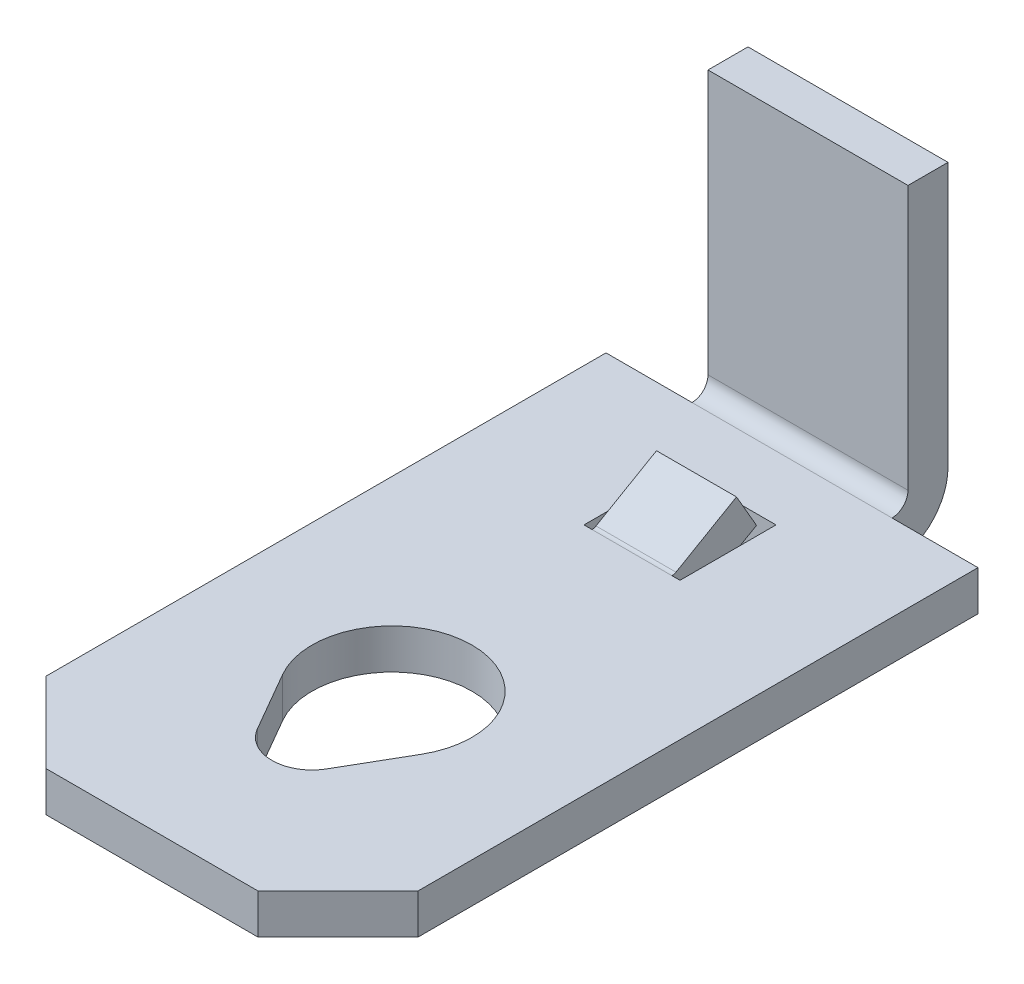
ISO-10303-21;
HEADER;
FILE_DESCRIPTION(('STEP AP214'),'2;1');
FILE_NAME('part.step','',(''),(''),'','','');
FILE_SCHEMA(('AUTOMOTIVE_DESIGN { 1 0 10303 214 1 1 1 1 }'));
ENDSEC;
DATA;
#1=APPLICATION_CONTEXT('core data for automotive mechanical design processes');
#2=APPLICATION_PROTOCOL_DEFINITION('international standard','automotive_design',2000,#1);
#3=PRODUCT_CONTEXT('',#1,'mechanical');
#4=PRODUCT('Part','Part','',(#3));
#5=PRODUCT_RELATED_PRODUCT_CATEGORY('part','',(#4));
#6=PRODUCT_DEFINITION_FORMATION('','',#4);
#7=PRODUCT_DEFINITION_CONTEXT('part definition',#1,'design');
#8=PRODUCT_DEFINITION('design','',#6,#7);
#9=PRODUCT_DEFINITION_SHAPE('','',#8);
#10=(LENGTH_UNIT() NAMED_UNIT(*) SI_UNIT(.MILLI.,.METRE.));
#11=(NAMED_UNIT(*) PLANE_ANGLE_UNIT() SI_UNIT($,.RADIAN.));
#12=(NAMED_UNIT(*) SI_UNIT($,.STERADIAN.) SOLID_ANGLE_UNIT());
#13=UNCERTAINTY_MEASURE_WITH_UNIT(LENGTH_MEASURE(1.E-05),#10,'distance_accuracy_value','');
#14=(GEOMETRIC_REPRESENTATION_CONTEXT(3) GLOBAL_UNCERTAINTY_ASSIGNED_CONTEXT((#13)) GLOBAL_UNIT_ASSIGNED_CONTEXT((#10,
#11,#12)) REPRESENTATION_CONTEXT('',''));
#15=CARTESIAN_POINT('',(0.,0.,0.));
#16=DIRECTION('',(0.,0.,1.));
#17=DIRECTION('',(1.,0.,0.));
#18=AXIS2_PLACEMENT_3D('',#15,#16,#17);
#19=CARTESIAN_POINT('',(0.,-1.29903810567665,-0.776794919243098));
#20=DIRECTION('',(0.,0.866025403784442,0.499999999999995));
#21=DIRECTION('',(0.,-0.499999999999995,0.866025403784442));
#22=AXIS2_PLACEMENT_3D('',#19,#20,#21);
#23=PLANE('',#22);
#24=DIRECTION('',(0.,0.499999999999995,-0.866025403784442));
#25=VECTOR('',#24,1.);
#26=CARTESIAN_POINT('',(-0.5,-0.419615242270665,-2.29999999999999));
#27=LINE('',#26,#25);
#28=CARTESIAN_POINT('',(-0.5,-0.419615242270665,-2.29999999999999));
#29=VERTEX_POINT('',#28);
#30=CARTESIAN_POINT('',(-0.5,0.0169872981077745,-3.0562177826491));
#31=VERTEX_POINT('',#30);
#32=EDGE_CURVE('E216',#29,#31,#27,.T.);
#33=ORIENTED_EDGE('',*,*,#32,.T.);
#34=DIRECTION('',(1.,0.,0.));
#35=VECTOR('',#34,1.);
#36=CARTESIAN_POINT('',(0.5,0.0169872981077746,-3.0562177826491));
#37=LINE('',#36,#35);
#38=CARTESIAN_POINT('',(0.5,0.0169872981077745,-3.0562177826491));
#39=VERTEX_POINT('',#38);
#40=EDGE_CURVE('E291',#31,#39,#37,.T.);
#41=ORIENTED_EDGE('',*,*,#40,.T.);
#42=DIRECTION('',(0.,-0.499999999999995,0.866025403784442));
#43=VECTOR('',#42,1.);
#44=CARTESIAN_POINT('',(0.5,0.0169872981077745,-3.0562177826491));
#45=LINE('',#44,#43);
#46=CARTESIAN_POINT('',(0.5,-0.419615242270665,-2.29999999999999));
#47=VERTEX_POINT('',#46);
#48=EDGE_CURVE('E283',#39,#47,#45,.T.);
#49=ORIENTED_EDGE('',*,*,#48,.T.);
#50=DIRECTION('',(-1.,0.,0.));
#51=VECTOR('',#50,1.);
#52=CARTESIAN_POINT('',(-0.5,-0.419615242270664,-2.29999999999999));
#53=LINE('',#52,#51);
#54=EDGE_CURVE('E263',#29,#47,#53,.F.);
#55=ORIENTED_EDGE('',*,*,#54,.F.);
#56=EDGE_LOOP('',(#33,#41,#49,#55));
#57=FACE_BOUND('',#56,.T.);
#58=ADVANCED_FACE('F17',(#57),#23,.F.);
#59=CARTESIAN_POINT('',(0.,0.,-4.7));
#60=DIRECTION('',(0.,0.,1.));
#61=DIRECTION('',(0.,-1.,0.));
#62=AXIS2_PLACEMENT_3D('',#59,#60,#61);
#63=PLANE('',#62);
#64=DIRECTION('',(0.,1.,0.));
#65=VECTOR('',#64,1.);
#66=CARTESIAN_POINT('',(-1.25,3.5,-4.7));
#67=LINE('',#66,#65);
#68=CARTESIAN_POINT('',(-1.25,0.2,-4.7));
#69=VERTEX_POINT('',#68);
#70=CARTESIAN_POINT('',(-1.25,3.5,-4.70000000000001));
#71=VERTEX_POINT('',#70);
#72=EDGE_CURVE('E285',#69,#71,#67,.T.);
#73=ORIENTED_EDGE('',*,*,#72,.T.);
#74=DIRECTION('',(1.,0.,0.));
#75=VECTOR('',#74,1.);
#76=CARTESIAN_POINT('',(1.25,3.5,-4.70000000000002));
#77=LINE('',#76,#75);
#78=CARTESIAN_POINT('',(1.25,3.5,-4.70000000000002));
#79=VERTEX_POINT('',#78);
#80=EDGE_CURVE('E273',#71,#79,#77,.T.);
#81=ORIENTED_EDGE('',*,*,#80,.T.);
#82=DIRECTION('',(0.,1.,0.));
#83=VECTOR('',#82,1.);
#84=CARTESIAN_POINT('',(1.25,0.,-4.70000000000002));
#85=LINE('',#84,#83);
#86=CARTESIAN_POINT('',(1.25,0.199999999999999,-4.70000000000001));
#87=VERTEX_POINT('',#86);
#88=EDGE_CURVE('E279',#79,#87,#85,.F.);
#89=ORIENTED_EDGE('',*,*,#88,.T.);
#90=DIRECTION('',(-1.,0.,0.));
#91=VECTOR('',#90,1.);
#92=CARTESIAN_POINT('',(-1.25,0.200000000000003,-4.7));
#93=LINE('',#92,#91);
#94=EDGE_CURVE('E218',#69,#87,#93,.F.);
#95=ORIENTED_EDGE('',*,*,#94,.F.);
#96=EDGE_LOOP('',(#73,#81,#89,#95));
#97=FACE_BOUND('',#96,.T.);
#98=ADVANCED_FACE('F777',(#97),#63,.F.);
#99=CARTESIAN_POINT('',(0.5,0.0169872981077745,-3.0562177826491));
#100=DIRECTION('',(0.,-0.499999999999995,0.866025403784442));
#101=DIRECTION('',(0.,-0.866025403784442,-0.499999999999995));
#102=AXIS2_PLACEMENT_3D('',#99,#100,#101);
#103=PLANE('',#102);
#104=DIRECTION('',(0.,-0.866025403784441,-0.499999999999995));
#105=VECTOR('',#104,1.);
#106=CARTESIAN_POINT('',(0.5,0.449999999999995,-2.80621778264911));
#107=LINE('',#106,#105);
#108=CARTESIAN_POINT('',(0.5,0.449999999999995,-2.80621778264911));
#109=VERTEX_POINT('',#108);
#110=EDGE_CURVE('E286',#109,#39,#107,.T.);
#111=ORIENTED_EDGE('',*,*,#110,.T.);
#112=ORIENTED_EDGE('',*,*,#40,.F.);
#113=DIRECTION('',(0.,-0.866025403784442,-0.499999999999995));
#114=VECTOR('',#113,1.);
#115=CARTESIAN_POINT('',(-0.5,0.0169872981077743,-3.0562177826491));
#116=LINE('',#115,#114);
#117=CARTESIAN_POINT('',(-0.5,0.449999999999995,-2.80621778264911));
#118=VERTEX_POINT('',#117);
#119=EDGE_CURVE('E300',#118,#31,#116,.T.);
#120=ORIENTED_EDGE('',*,*,#119,.F.);
#121=DIRECTION('',(1.,0.,0.));
#122=VECTOR('',#121,1.);
#123=CARTESIAN_POINT('',(0.,0.449999999999995,-2.80621778264911));
#124=LINE('',#123,#122);
#125=EDGE_CURVE('E294',#109,#118,#124,.F.);
#126=ORIENTED_EDGE('',*,*,#125,.F.);
#127=EDGE_LOOP('',(#111,#112,#120,#126));
#128=FACE_BOUND('',#127,.T.);
#129=ADVANCED_FACE('F768',(#128),#103,.F.);
#130=CARTESIAN_POINT('',(1.25,3.5,-4.70000000000002));
#131=DIRECTION('',(0.,-1.,0.));
#132=DIRECTION('',(0.,0.,-1.));
#133=AXIS2_PLACEMENT_3D('',#130,#131,#132);
#134=PLANE('',#133);
#135=DIRECTION('',(0.,0.,-1.));
#136=VECTOR('',#135,1.);
#137=CARTESIAN_POINT('',(1.25,3.5,-4.70000000000002));
#138=LINE('',#137,#136);
#139=CARTESIAN_POINT('',(1.25,3.5,-4.20000000000002));
#140=VERTEX_POINT('',#139);
#141=EDGE_CURVE('E271',#79,#140,#138,.F.);
#142=ORIENTED_EDGE('',*,*,#141,.F.);
#143=ORIENTED_EDGE('',*,*,#80,.F.);
#144=DIRECTION('',(0.,0.,-1.));
#145=VECTOR('',#144,1.);
#146=CARTESIAN_POINT('',(-1.25,3.5,-4.70000000000002));
#147=LINE('',#146,#145);
#148=CARTESIAN_POINT('',(-1.25,3.5,-4.20000000000002));
#149=VERTEX_POINT('',#148);
#150=EDGE_CURVE('E276',#149,#71,#147,.T.);
#151=ORIENTED_EDGE('',*,*,#150,.F.);
#152=DIRECTION('',(1.,0.,0.));
#153=VECTOR('',#152,1.);
#154=CARTESIAN_POINT('',(0.,3.5,-4.20000000000002));
#155=LINE('',#154,#153);
#156=EDGE_CURVE('E264',#140,#149,#155,.F.);
#157=ORIENTED_EDGE('',*,*,#156,.F.);
#158=EDGE_LOOP('',(#142,#143,#151,#157));
#159=FACE_BOUND('',#158,.T.);
#160=ADVANCED_FACE('F760',(#159),#134,.F.);
#161=CARTESIAN_POINT('',(-0.5,0.100000000000001,-2.));
#162=DIRECTION('',(-1.,0.,0.));
#163=DIRECTION('',(0.,-1.,0.));
#164=AXIS2_PLACEMENT_3D('',#161,#162,#163);
#165=CYLINDRICAL_SURFACE('',#164,0.6);
#166=ORIENTED_EDGE('',*,*,#54,.T.);
#167=CARTESIAN_POINT('',(0.5,0.1,-2.));
#168=DIRECTION('',(-1.,0.,0.));
#169=DIRECTION('',(0.,-1.,0.));
#170=AXIS2_PLACEMENT_3D('',#167,#168,#169);
#171=CIRCLE('',#170,0.6);
#172=CARTESIAN_POINT('',(0.5,-0.5,-2.));
#173=VERTEX_POINT('',#172);
#174=EDGE_CURVE('E195',#173,#47,#171,.F.);
#175=ORIENTED_EDGE('',*,*,#174,.F.);
#176=DIRECTION('',(1.,0.,0.));
#177=VECTOR('',#176,1.);
#178=CARTESIAN_POINT('',(0.,-0.5,-2.));
#179=LINE('',#178,#177);
#180=CARTESIAN_POINT('',(-0.5,-0.5,-2.));
#181=VERTEX_POINT('',#180);
#182=EDGE_CURVE('E188',#173,#181,#179,.F.);
#183=ORIENTED_EDGE('',*,*,#182,.T.);
#184=CARTESIAN_POINT('',(-0.5,0.100000000000001,-2.));
#185=DIRECTION('',(-1.,0.,0.));
#186=DIRECTION('',(0.,-1.,0.));
#187=AXIS2_PLACEMENT_3D('',#184,#185,#186);
#188=CIRCLE('',#187,0.6);
#189=EDGE_CURVE('E20',#181,#29,#188,.F.);
#190=ORIENTED_EDGE('',*,*,#189,.T.);
#191=EDGE_LOOP('',(#166,#175,#183,#190));
#192=FACE_BOUND('',#191,.T.);
#193=ADVANCED_FACE('F191',(#192),#165,.T.);
#194=CARTESIAN_POINT('',(-1.25,0.199999999999998,-4.));
#195=DIRECTION('',(-1.,0.,0.));
#196=DIRECTION('',(0.,0.,1.));
#197=AXIS2_PLACEMENT_3D('',#194,#195,#196);
#198=CYLINDRICAL_SURFACE('',#197,0.700000000000001);
#199=ORIENTED_EDGE('',*,*,#94,.T.);
#200=CARTESIAN_POINT('',(1.25,0.199999999999998,-4.));
#201=DIRECTION('',(-1.,0.,0.));
#202=DIRECTION('',(0.,0.,1.));
#203=AXIS2_PLACEMENT_3D('',#200,#201,#202);
#204=CIRCLE('',#203,0.700000000000001);
#205=CARTESIAN_POINT('',(1.25,-0.500000000000002,-4.));
#206=VERTEX_POINT('',#205);
#207=EDGE_CURVE('E267',#206,#87,#204,.F.);
#208=ORIENTED_EDGE('',*,*,#207,.F.);
#209=DIRECTION('',(1.,0.,0.));
#210=VECTOR('',#209,1.);
#211=CARTESIAN_POINT('',(0.,-0.5,-4.));
#212=LINE('',#211,#210);
#213=CARTESIAN_POINT('',(-1.25,-0.500000000000002,-4.));
#214=VERTEX_POINT('',#213);
#215=EDGE_CURVE('E198',#206,#214,#212,.F.);
#216=ORIENTED_EDGE('',*,*,#215,.T.);
#217=CARTESIAN_POINT('',(-1.25,0.199999999999998,-4.));
#218=DIRECTION('',(-1.,0.,0.));
#219=DIRECTION('',(0.,0.,1.));
#220=AXIS2_PLACEMENT_3D('',#217,#218,#219);
#221=CIRCLE('',#220,0.700000000000001);
#222=EDGE_CURVE('E199',#214,#69,#221,.F.);
#223=ORIENTED_EDGE('',*,*,#222,.T.);
#224=EDGE_LOOP('',(#199,#208,#216,#223));
#225=FACE_BOUND('',#224,.T.);
#226=ADVANCED_FACE('F744',(#225),#198,.T.);
#227=CARTESIAN_POINT('',(-0.5,0.100000000000001,-2.));
#228=DIRECTION('',(1.,0.,0.));
#229=DIRECTION('',(0.,1.,0.));
#230=AXIS2_PLACEMENT_3D('',#227,#228,#229);
#231=PLANE('',#230);
#232=CARTESIAN_POINT('',(-0.5,0.100000000000001,-2.));
#233=DIRECTION('',(-1.,0.,0.));
#234=DIRECTION('',(0.,-1.,0.));
#235=AXIS2_PLACEMENT_3D('',#232,#233,#234);
#236=CIRCLE('',#235,0.1);
#237=CARTESIAN_POINT('',(-0.5,0.,-2.));
#238=VERTEX_POINT('',#237);
#239=CARTESIAN_POINT('',(-0.5,0.0133974596215563,-2.05));
#240=VERTEX_POINT('',#239);
#241=EDGE_CURVE('E344',#238,#240,#236,.F.);
#242=ORIENTED_EDGE('',*,*,#241,.T.);
#243=DIRECTION('',(0.,-0.499999999999995,0.866025403784442));
#244=VECTOR('',#243,1.);
#245=CARTESIAN_POINT('',(-0.5,-0.866025403784431,-0.526794919243101));
#246=LINE('',#245,#244);
#247=EDGE_CURVE('E217',#118,#240,#246,.T.);
#248=ORIENTED_EDGE('',*,*,#247,.F.);
#249=ORIENTED_EDGE('',*,*,#119,.T.);
#250=ORIENTED_EDGE('',*,*,#32,.F.);
#251=ORIENTED_EDGE('',*,*,#189,.F.);
#252=DIRECTION('',(0.,1.,0.));
#253=VECTOR('',#252,1.);
#254=CARTESIAN_POINT('',(-0.5,-0.500050000000003,-2.));
#255=LINE('',#254,#253);
#256=EDGE_CURVE('E209',#181,#238,#255,.T.);
#257=ORIENTED_EDGE('',*,*,#256,.T.);
#258=EDGE_LOOP('',(#242,#248,#249,#250,#251,#257));
#259=FACE_BOUND('',#258,.T.);
#260=ADVANCED_FACE('F213',(#259),#231,.F.);
#261=CARTESIAN_POINT('',(0.,-0.866025403784431,-0.526794919243101));
#262=DIRECTION('',(0.,0.866025403784442,0.499999999999995));
#263=DIRECTION('',(0.,-0.499999999999995,0.866025403784442));
#264=AXIS2_PLACEMENT_3D('',#261,#262,#263);
#265=PLANE('',#264);
#266=DIRECTION('',(0.,-0.499999999999995,0.866025403784442));
#267=VECTOR('',#266,1.);
#268=CARTESIAN_POINT('',(0.5,-0.866025403784431,-0.526794919243101));
#269=LINE('',#268,#267);
#270=CARTESIAN_POINT('',(0.5,0.0133974596215558,-2.05));
#271=VERTEX_POINT('',#270);
#272=EDGE_CURVE('E297',#271,#109,#269,.F.);
#273=ORIENTED_EDGE('',*,*,#272,.T.);
#274=ORIENTED_EDGE('',*,*,#125,.T.);
#275=ORIENTED_EDGE('',*,*,#247,.T.);
#276=DIRECTION('',(-1.,0.,0.));
#277=VECTOR('',#276,1.);
#278=CARTESIAN_POINT('',(-0.5,0.0133974596215566,-2.05));
#279=LINE('',#278,#277);
#280=EDGE_CURVE('E343',#240,#271,#279,.F.);
#281=ORIENTED_EDGE('',*,*,#280,.T.);
#282=EDGE_LOOP('',(#273,#274,#275,#281));
#283=FACE_BOUND('',#282,.T.);
#284=ADVANCED_FACE('F387',(#283),#265,.T.);
#285=CARTESIAN_POINT('',(0.5,0.1,-2.));
#286=DIRECTION('',(1.,0.,0.));
#287=DIRECTION('',(0.,1.,0.));
#288=AXIS2_PLACEMENT_3D('',#285,#286,#287);
#289=PLANE('',#288);
#290=DIRECTION('',(0.,1.,0.));
#291=VECTOR('',#290,1.);
#292=CARTESIAN_POINT('',(0.5,-0.500050000000003,-2.));
#293=LINE('',#292,#291);
#294=CARTESIAN_POINT('',(0.5,0.,-2.));
#295=VERTEX_POINT('',#294);
#296=EDGE_CURVE('E241',#295,#173,#293,.F.);
#297=ORIENTED_EDGE('',*,*,#296,.T.);
#298=ORIENTED_EDGE('',*,*,#174,.T.);
#299=ORIENTED_EDGE('',*,*,#48,.F.);
#300=ORIENTED_EDGE('',*,*,#110,.F.);
#301=ORIENTED_EDGE('',*,*,#272,.F.);
#302=CARTESIAN_POINT('',(0.5,0.1,-2.));
#303=DIRECTION('',(-1.,0.,0.));
#304=DIRECTION('',(0.,-1.,0.));
#305=AXIS2_PLACEMENT_3D('',#302,#303,#304);
#306=CIRCLE('',#305,0.1);
#307=EDGE_CURVE('E341',#271,#295,#306,.T.);
#308=ORIENTED_EDGE('',*,*,#307,.T.);
#309=EDGE_LOOP('',(#297,#298,#299,#300,#301,#308));
#310=FACE_BOUND('',#309,.T.);
#311=ADVANCED_FACE('F395',(#310),#289,.T.);
#312=CARTESIAN_POINT('',(0.,0.,-4.2));
#313=DIRECTION('',(0.,0.,1.));
#314=DIRECTION('',(0.,-1.,0.));
#315=AXIS2_PLACEMENT_3D('',#312,#313,#314);
#316=PLANE('',#315);
#317=DIRECTION('',(0.,-1.,0.));
#318=VECTOR('',#317,1.);
#319=CARTESIAN_POINT('',(1.25,0.,-4.2));
#320=LINE('',#319,#318);
#321=CARTESIAN_POINT('',(1.25,0.199999999999996,-4.2));
#322=VERTEX_POINT('',#321);
#323=EDGE_CURVE('E268',#322,#140,#320,.F.);
#324=ORIENTED_EDGE('',*,*,#323,.T.);
#325=ORIENTED_EDGE('',*,*,#156,.T.);
#326=DIRECTION('',(0.,-1.,0.));
#327=VECTOR('',#326,1.);
#328=CARTESIAN_POINT('',(-1.25,0.,-4.2));
#329=LINE('',#328,#327);
#330=CARTESIAN_POINT('',(-1.25,0.199999999999997,-4.2));
#331=VERTEX_POINT('',#330);
#332=EDGE_CURVE('E348',#149,#331,#329,.T.);
#333=ORIENTED_EDGE('',*,*,#332,.T.);
#334=DIRECTION('',(-1.,0.,0.));
#335=VECTOR('',#334,1.);
#336=CARTESIAN_POINT('',(-1.25,0.199999999999997,-4.2));
#337=LINE('',#336,#335);
#338=EDGE_CURVE('E330',#331,#322,#337,.F.);
#339=ORIENTED_EDGE('',*,*,#338,.T.);
#340=EDGE_LOOP('',(#324,#325,#333,#339));
#341=FACE_BOUND('',#340,.T.);
#342=ADVANCED_FACE('F714',(#341),#316,.T.);
#343=CARTESIAN_POINT('',(1.25,0.199999999999998,-4.));
#344=DIRECTION('',(1.,0.,0.));
#345=DIRECTION('',(0.,0.,-1.));
#346=AXIS2_PLACEMENT_3D('',#343,#344,#345);
#347=PLANE('',#346);
#348=DIRECTION('',(0.,1.,0.));
#349=VECTOR('',#348,1.);
#350=CARTESIAN_POINT('',(1.25,-0.5,-4.));
#351=LINE('',#350,#349);
#352=CARTESIAN_POINT('',(1.25,0.,-4.));
#353=VERTEX_POINT('',#352);
#354=EDGE_CURVE('E438',#206,#353,#351,.T.);
#355=ORIENTED_EDGE('',*,*,#354,.F.);
#356=ORIENTED_EDGE('',*,*,#207,.T.);
#357=ORIENTED_EDGE('',*,*,#88,.F.);
#358=ORIENTED_EDGE('',*,*,#141,.T.);
#359=ORIENTED_EDGE('',*,*,#323,.F.);
#360=CARTESIAN_POINT('',(1.25,0.199999999999998,-4.));
#361=DIRECTION('',(-1.,0.,0.));
#362=DIRECTION('',(0.,0.,1.));
#363=AXIS2_PLACEMENT_3D('',#360,#361,#362);
#364=CIRCLE('',#363,0.200000000000001);
#365=EDGE_CURVE('E327',#322,#353,#364,.T.);
#366=ORIENTED_EDGE('',*,*,#365,.T.);
#367=EDGE_LOOP('',(#355,#356,#357,#358,#359,#366));
#368=FACE_BOUND('',#367,.T.);
#369=ADVANCED_FACE('F524',(#368),#347,.T.);
#370=CARTESIAN_POINT('',(-1.25,0.199999999999998,-4.));
#371=DIRECTION('',(1.,0.,0.));
#372=DIRECTION('',(0.,0.,-1.));
#373=AXIS2_PLACEMENT_3D('',#370,#371,#372);
#374=PLANE('',#373);
#375=CARTESIAN_POINT('',(-1.25,0.199999999999998,-4.));
#376=DIRECTION('',(-1.,0.,0.));
#377=DIRECTION('',(0.,0.,1.));
#378=AXIS2_PLACEMENT_3D('',#375,#376,#377);
#379=CIRCLE('',#378,0.200000000000001);
#380=CARTESIAN_POINT('',(-1.25,0.,-4.));
#381=VERTEX_POINT('',#380);
#382=EDGE_CURVE('E331',#381,#331,#379,.F.);
#383=ORIENTED_EDGE('',*,*,#382,.T.);
#384=ORIENTED_EDGE('',*,*,#332,.F.);
#385=ORIENTED_EDGE('',*,*,#150,.T.);
#386=ORIENTED_EDGE('',*,*,#72,.F.);
#387=ORIENTED_EDGE('',*,*,#222,.F.);
#388=DIRECTION('',(0.,1.,0.));
#389=VECTOR('',#388,1.);
#390=CARTESIAN_POINT('',(-1.25,-0.5,-4.));
#391=LINE('',#390,#389);
#392=EDGE_CURVE('E329',#381,#214,#391,.F.);
#393=ORIENTED_EDGE('',*,*,#392,.F.);
#394=EDGE_LOOP('',(#383,#384,#385,#386,#387,#393));
#395=FACE_BOUND('',#394,.T.);
#396=ADVANCED_FACE('F515',(#395),#374,.F.);
#397=CARTESIAN_POINT('',(0.,-0.5,0.));
#398=DIRECTION('',(0.,1.,0.));
#399=DIRECTION('',(0.,0.,1.));
#400=AXIS2_PLACEMENT_3D('',#397,#398,#399);
#401=PLANE('',#400);
#402=DIRECTION('',(-0.707106781186546,0.,0.707106781186549));
#403=VECTOR('',#402,1.);
#404=CARTESIAN_POINT('',(1.325,-0.5,4.));
#405=LINE('',#404,#403);
#406=CARTESIAN_POINT('',(2.32500000000001,-0.5,3.));
#407=VERTEX_POINT('',#406);
#408=CARTESIAN_POINT('',(1.325,-0.5,4.));
#409=VERTEX_POINT('',#408);
#410=EDGE_CURVE('E444',#407,#409,#405,.T.);
#411=ORIENTED_EDGE('',*,*,#410,.T.);
#412=DIRECTION('',(1.,0.,0.));
#413=VECTOR('',#412,1.);
#414=CARTESIAN_POINT('',(2.32500000000001,-0.5,4.));
#415=LINE('',#414,#413);
#416=CARTESIAN_POINT('',(-1.32499999999999,-0.5,4.));
#417=VERTEX_POINT('',#416);
#418=EDGE_CURVE('E449',#417,#409,#415,.T.);
#419=ORIENTED_EDGE('',*,*,#418,.F.);
#420=DIRECTION('',(0.707106781186549,0.,0.707106781186546));
#421=VECTOR('',#420,1.);
#422=CARTESIAN_POINT('',(-2.32499999999999,-0.5,3.));
#423=LINE('',#422,#421);
#424=CARTESIAN_POINT('',(-2.325,-0.5,3.));
#425=VERTEX_POINT('',#424);
#426=EDGE_CURVE('E210',#425,#417,#423,.T.);
#427=ORIENTED_EDGE('',*,*,#426,.F.);
#428=DIRECTION('',(0.,0.,1.));
#429=VECTOR('',#428,1.);
#430=CARTESIAN_POINT('',(-2.32499999999999,-0.5,4.));
#431=LINE('',#430,#429);
#432=CARTESIAN_POINT('',(-2.32499999999999,-0.5,-4.));
#433=VERTEX_POINT('',#432);
#434=EDGE_CURVE('E433',#433,#425,#431,.T.);
#435=ORIENTED_EDGE('',*,*,#434,.F.);
#436=DIRECTION('',(-1.,0.,0.));
#437=VECTOR('',#436,1.);
#438=CARTESIAN_POINT('',(2.32500000000001,-0.5,-4.));
#439=LINE('',#438,#437);
#440=EDGE_CURVE('E435',#214,#433,#439,.T.);
#441=ORIENTED_EDGE('',*,*,#440,.F.);
#442=ORIENTED_EDGE('',*,*,#215,.F.);
#443=DIRECTION('',(-1.,0.,0.));
#444=VECTOR('',#443,1.);
#445=CARTESIAN_POINT('',(2.32500000000001,-0.5,-4.));
#446=LINE('',#445,#444);
#447=CARTESIAN_POINT('',(2.32500000000001,-0.5,-4.));
#448=VERTEX_POINT('',#447);
#449=EDGE_CURVE('E333',#448,#206,#446,.T.);
#450=ORIENTED_EDGE('',*,*,#449,.F.);
#451=DIRECTION('',(0.,0.,-1.));
#452=VECTOR('',#451,1.);
#453=CARTESIAN_POINT('',(2.32500000000001,-0.5,4.));
#454=LINE('',#453,#452);
#455=EDGE_CURVE('E439',#407,#448,#454,.T.);
#456=ORIENTED_EDGE('',*,*,#455,.F.);
#457=EDGE_LOOP('',(#411,#419,#427,#435,#441,#442,#450,#456));
#458=FACE_BOUND('',#457,.T.);
#459=CARTESIAN_POINT('',(0.,-0.5,1.));
#460=DIRECTION('',(0.,1.,0.));
#461=DIRECTION('',(0.,0.,1.));
#462=AXIS2_PLACEMENT_3D('',#459,#460,#461);
#463=CIRCLE('',#462,1.);
#464=CARTESIAN_POINT('',(0.866025403784439,-0.5,1.5));
#465=VERTEX_POINT('',#464);
#466=CARTESIAN_POINT('',(-0.866025403784439,-0.5,1.5));
#467=VERTEX_POINT('',#466);
#468=EDGE_CURVE('E338',#465,#467,#463,.T.);
#469=ORIENTED_EDGE('',*,*,#468,.T.);
#470=DIRECTION('',(0.5,0.,0.866025403784439));
#471=VECTOR('',#470,1.);
#472=CARTESIAN_POINT('',(-0.866025403784439,-0.5,1.5));
#473=LINE('',#472,#471);
#474=CARTESIAN_POINT('',(-0.43301270189222,-0.5,2.25));
#475=VERTEX_POINT('',#474);
#476=EDGE_CURVE('E336',#467,#475,#473,.T.);
#477=ORIENTED_EDGE('',*,*,#476,.T.);
#478=CARTESIAN_POINT('',(0.,-0.5,2.));
#479=DIRECTION('',(0.,1.,0.));
#480=DIRECTION('',(0.,0.,1.));
#481=AXIS2_PLACEMENT_3D('',#478,#479,#480);
#482=CIRCLE('',#481,0.5);
#483=CARTESIAN_POINT('',(0.433012701892219,-0.5,2.25));
#484=VERTEX_POINT('',#483);
#485=EDGE_CURVE('E334',#475,#484,#482,.T.);
#486=ORIENTED_EDGE('',*,*,#485,.T.);
#487=DIRECTION('',(0.5,0.,-0.866025403784439));
#488=VECTOR('',#487,1.);
#489=CARTESIAN_POINT('',(0.866025403784439,-0.5,1.5));
#490=LINE('',#489,#488);
#491=EDGE_CURVE('E340',#484,#465,#490,.T.);
#492=ORIENTED_EDGE('',*,*,#491,.T.);
#493=EDGE_LOOP('',(#469,#477,#486,#492));
#494=FACE_BOUND('',#493,.T.);
#495=DIRECTION('',(1.,0.,0.));
#496=VECTOR('',#495,1.);
#497=CARTESIAN_POINT('',(-0.600000000000001,-0.5,-2.));
#498=LINE('',#497,#496);
#499=CARTESIAN_POINT('',(-0.600000000000001,-0.5,-2.));
#500=VERTEX_POINT('',#499);
#501=EDGE_CURVE('E202',#500,#181,#498,.T.);
#502=ORIENTED_EDGE('',*,*,#501,.T.);
#503=ORIENTED_EDGE('',*,*,#182,.F.);
#504=DIRECTION('',(1.,0.,0.));
#505=VECTOR('',#504,1.);
#506=CARTESIAN_POINT('',(-0.600000000000001,-0.5,-2.));
#507=LINE('',#506,#505);
#508=CARTESIAN_POINT('',(0.6,-0.5,-2.));
#509=VERTEX_POINT('',#508);
#510=EDGE_CURVE('E229',#173,#509,#507,.T.);
#511=ORIENTED_EDGE('',*,*,#510,.T.);
#512=DIRECTION('',(0.,0.,-1.));
#513=VECTOR('',#512,1.);
#514=CARTESIAN_POINT('',(0.6,-0.5,-2.));
#515=LINE('',#514,#513);
#516=CARTESIAN_POINT('',(0.6,-0.5,-3.2));
#517=VERTEX_POINT('',#516);
#518=EDGE_CURVE('E235',#509,#517,#515,.T.);
#519=ORIENTED_EDGE('',*,*,#518,.T.);
#520=DIRECTION('',(-1.,0.,0.));
#521=VECTOR('',#520,1.);
#522=CARTESIAN_POINT('',(0.6,-0.5,-3.2));
#523=LINE('',#522,#521);
#524=CARTESIAN_POINT('',(-0.6,-0.5,-3.2));
#525=VERTEX_POINT('',#524);
#526=EDGE_CURVE('E244',#517,#525,#523,.T.);
#527=ORIENTED_EDGE('',*,*,#526,.T.);
#528=DIRECTION('',(0.,0.,1.));
#529=VECTOR('',#528,1.);
#530=CARTESIAN_POINT('',(-0.6,-0.5,-3.2));
#531=LINE('',#530,#529);
#532=EDGE_CURVE('E205',#525,#500,#531,.T.);
#533=ORIENTED_EDGE('',*,*,#532,.T.);
#534=EDGE_LOOP('',(#502,#503,#511,#519,#527,#533));
#535=FACE_BOUND('',#534,.T.);
#536=ADVANCED_FACE('F203',(#458,#494,#535),#401,.F.);
#537=CARTESIAN_POINT('',(-0.600000000000001,-0.500050000000003,-2.));
#538=DIRECTION('',(0.,0.,1.));
#539=DIRECTION('',(1.,0.,0.));
#540=AXIS2_PLACEMENT_3D('',#537,#538,#539);
#541=PLANE('',#540);
#542=ORIENTED_EDGE('',*,*,#256,.F.);
#543=ORIENTED_EDGE('',*,*,#501,.F.);
#544=DIRECTION('',(0.,1.,0.));
#545=VECTOR('',#544,1.);
#546=CARTESIAN_POINT('',(-0.600000000000001,-0.500050000000003,-2.));
#547=LINE('',#546,#545);
#548=CARTESIAN_POINT('',(-0.600000000000001,0.,-2.));
#549=VERTEX_POINT('',#548);
#550=EDGE_CURVE('E224',#500,#549,#547,.T.);
#551=ORIENTED_EDGE('',*,*,#550,.T.);
#552=DIRECTION('',(1.,0.,0.));
#553=VECTOR('',#552,1.);
#554=CARTESIAN_POINT('',(0.,0.,-2.));
#555=LINE('',#554,#553);
#556=EDGE_CURVE('E221',#238,#549,#555,.F.);
#557=ORIENTED_EDGE('',*,*,#556,.F.);
#558=EDGE_LOOP('',(#542,#543,#551,#557));
#559=FACE_BOUND('',#558,.T.);
#560=ADVANCED_FACE('F219',(#559),#541,.F.);
#561=CARTESIAN_POINT('',(-0.6,-0.500050000000003,-3.2));
#562=DIRECTION('',(-1.,0.,0.));
#563=DIRECTION('',(0.,0.,1.));
#564=AXIS2_PLACEMENT_3D('',#561,#562,#563);
#565=PLANE('',#564);
#566=DIRECTION('',(0.,0.,1.));
#567=VECTOR('',#566,1.);
#568=CARTESIAN_POINT('',(-0.600000000000001,0.,0.));
#569=LINE('',#568,#567);
#570=CARTESIAN_POINT('',(-0.600000000000001,0.,-3.2));
#571=VERTEX_POINT('',#570);
#572=EDGE_CURVE('E418',#549,#571,#569,.F.);
#573=ORIENTED_EDGE('',*,*,#572,.F.);
#574=ORIENTED_EDGE('',*,*,#550,.F.);
#575=ORIENTED_EDGE('',*,*,#532,.F.);
#576=DIRECTION('',(0.,1.,0.));
#577=VECTOR('',#576,1.);
#578=CARTESIAN_POINT('',(-0.6,-0.500050000000003,-3.2));
#579=LINE('',#578,#577);
#580=EDGE_CURVE('E237',#525,#571,#579,.T.);
#581=ORIENTED_EDGE('',*,*,#580,.T.);
#582=EDGE_LOOP('',(#573,#574,#575,#581));
#583=FACE_BOUND('',#582,.T.);
#584=ADVANCED_FACE('F417',(#583),#565,.F.);
#585=CARTESIAN_POINT('',(0.6,-0.500050000000003,-3.2));
#586=DIRECTION('',(0.,0.,-1.));
#587=DIRECTION('',(-1.,0.,0.));
#588=AXIS2_PLACEMENT_3D('',#585,#586,#587);
#589=PLANE('',#588);
#590=DIRECTION('',(1.,0.,0.));
#591=VECTOR('',#590,1.);
#592=CARTESIAN_POINT('',(0.,0.,-3.2));
#593=LINE('',#592,#591);
#594=CARTESIAN_POINT('',(0.6,0.,-3.2));
#595=VERTEX_POINT('',#594);
#596=EDGE_CURVE('E413',#571,#595,#593,.T.);
#597=ORIENTED_EDGE('',*,*,#596,.F.);
#598=ORIENTED_EDGE('',*,*,#580,.F.);
#599=ORIENTED_EDGE('',*,*,#526,.F.);
#600=DIRECTION('',(0.,1.,0.));
#601=VECTOR('',#600,1.);
#602=CARTESIAN_POINT('',(0.6,-0.500050000000003,-3.2));
#603=LINE('',#602,#601);
#604=EDGE_CURVE('E232',#517,#595,#603,.T.);
#605=ORIENTED_EDGE('',*,*,#604,.T.);
#606=EDGE_LOOP('',(#597,#598,#599,#605));
#607=FACE_BOUND('',#606,.T.);
#608=ADVANCED_FACE('F411',(#607),#589,.F.);
#609=CARTESIAN_POINT('',(0.6,-0.500050000000003,-2.));
#610=DIRECTION('',(1.,0.,0.));
#611=DIRECTION('',(0.,0.,-1.));
#612=AXIS2_PLACEMENT_3D('',#609,#610,#611);
#613=PLANE('',#612);
#614=DIRECTION('',(0.,0.,1.));
#615=VECTOR('',#614,1.);
#616=CARTESIAN_POINT('',(0.6,0.,0.));
#617=LINE('',#616,#615);
#618=CARTESIAN_POINT('',(0.6,0.,-2.));
#619=VERTEX_POINT('',#618);
#620=EDGE_CURVE('E378',#595,#619,#617,.T.);
#621=ORIENTED_EDGE('',*,*,#620,.F.);
#622=ORIENTED_EDGE('',*,*,#604,.F.);
#623=ORIENTED_EDGE('',*,*,#518,.F.);
#624=DIRECTION('',(0.,1.,0.));
#625=VECTOR('',#624,1.);
#626=CARTESIAN_POINT('',(0.6,-0.500050000000003,-2.));
#627=LINE('',#626,#625);
#628=EDGE_CURVE('E231',#509,#619,#627,.T.);
#629=ORIENTED_EDGE('',*,*,#628,.T.);
#630=EDGE_LOOP('',(#621,#622,#623,#629));
#631=FACE_BOUND('',#630,.T.);
#632=ADVANCED_FACE('F407',(#631),#613,.F.);
#633=CARTESIAN_POINT('',(-0.600000000000001,-0.500050000000003,-2.));
#634=DIRECTION('',(0.,0.,1.));
#635=DIRECTION('',(1.,0.,0.));
#636=AXIS2_PLACEMENT_3D('',#633,#634,#635);
#637=PLANE('',#636);
#638=DIRECTION('',(1.,0.,0.));
#639=VECTOR('',#638,1.);
#640=CARTESIAN_POINT('',(0.,0.,-2.));
#641=LINE('',#640,#639);
#642=EDGE_CURVE('E375',#619,#295,#641,.F.);
#643=ORIENTED_EDGE('',*,*,#642,.F.);
#644=ORIENTED_EDGE('',*,*,#628,.F.);
#645=ORIENTED_EDGE('',*,*,#510,.F.);
#646=ORIENTED_EDGE('',*,*,#296,.F.);
#647=EDGE_LOOP('',(#643,#644,#645,#646));
#648=FACE_BOUND('',#647,.T.);
#649=ADVANCED_FACE('F399',(#648),#637,.F.);
#650=CARTESIAN_POINT('',(-0.5,0.100000000000001,-2.));
#651=DIRECTION('',(-1.,0.,0.));
#652=DIRECTION('',(0.,-1.,0.));
#653=AXIS2_PLACEMENT_3D('',#650,#651,#652);
#654=CYLINDRICAL_SURFACE('',#653,0.1);
#655=ORIENTED_EDGE('',*,*,#307,.F.);
#656=ORIENTED_EDGE('',*,*,#280,.F.);
#657=ORIENTED_EDGE('',*,*,#241,.F.);
#658=DIRECTION('',(1.,0.,0.));
#659=VECTOR('',#658,1.);
#660=CARTESIAN_POINT('',(0.,0.,-2.));
#661=LINE('',#660,#659);
#662=EDGE_CURVE('E326',#295,#238,#661,.F.);
#663=ORIENTED_EDGE('',*,*,#662,.F.);
#664=EDGE_LOOP('',(#655,#656,#657,#663));
#665=FACE_BOUND('',#664,.T.);
#666=ADVANCED_FACE('F392',(#665),#654,.F.);
#667=CARTESIAN_POINT('',(0.,-0.500050000000003,1.));
#668=DIRECTION('',(0.,1.,0.));
#669=DIRECTION('',(0.,0.,1.));
#670=AXIS2_PLACEMENT_3D('',#667,#668,#669);
#671=CYLINDRICAL_SURFACE('',#670,1.);
#672=CARTESIAN_POINT('',(0.,0.,1.));
#673=DIRECTION('',(0.,1.,0.));
#674=DIRECTION('',(0.,0.,1.));
#675=AXIS2_PLACEMENT_3D('',#672,#673,#674);
#676=CIRCLE('',#675,1.);
#677=CARTESIAN_POINT('',(-0.866025403784439,0.,1.5));
#678=VERTEX_POINT('',#677);
#679=CARTESIAN_POINT('',(0.866025403784439,0.,1.5));
#680=VERTEX_POINT('',#679);
#681=EDGE_CURVE('E323',#678,#680,#676,.F.);
#682=ORIENTED_EDGE('',*,*,#681,.F.);
#683=DIRECTION('',(0.,1.,0.));
#684=VECTOR('',#683,1.);
#685=CARTESIAN_POINT('',(-0.866025403784439,-0.500050000000003,1.5));
#686=LINE('',#685,#684);
#687=EDGE_CURVE('E451',#678,#467,#686,.F.);
#688=ORIENTED_EDGE('',*,*,#687,.T.);
#689=ORIENTED_EDGE('',*,*,#468,.F.);
#690=DIRECTION('',(0.,1.,0.));
#691=VECTOR('',#690,1.);
#692=CARTESIAN_POINT('',(0.866025403784439,-0.500050000000003,1.5));
#693=LINE('',#692,#691);
#694=EDGE_CURVE('E369',#465,#680,#693,.T.);
#695=ORIENTED_EDGE('',*,*,#694,.T.);
#696=EDGE_LOOP('',(#682,#688,#689,#695));
#697=FACE_BOUND('',#696,.T.);
#698=ADVANCED_FACE('F512',(#697),#671,.F.);
#699=CARTESIAN_POINT('',(0.866025403784439,-0.500050000000003,1.5));
#700=DIRECTION('',(0.866025403784439,0.,0.5));
#701=DIRECTION('',(0.5,0.,-0.866025403784439));
#702=AXIS2_PLACEMENT_3D('',#699,#700,#701);
#703=PLANE('',#702);
#704=DIRECTION('',(-0.5,0.,0.866025403784439));
#705=VECTOR('',#704,1.);
#706=CARTESIAN_POINT('',(0.866025403784439,0.,1.5));
#707=LINE('',#706,#705);
#708=CARTESIAN_POINT('',(0.433012701892219,0.,2.25));
#709=VERTEX_POINT('',#708);
#710=EDGE_CURVE('E322',#680,#709,#707,.T.);
#711=ORIENTED_EDGE('',*,*,#710,.F.);
#712=ORIENTED_EDGE('',*,*,#694,.F.);
#713=ORIENTED_EDGE('',*,*,#491,.F.);
#714=DIRECTION('',(0.,1.,0.));
#715=VECTOR('',#714,1.);
#716=CARTESIAN_POINT('',(0.433012701892219,-0.500050000000003,2.25));
#717=LINE('',#716,#715);
#718=EDGE_CURVE('E337',#484,#709,#717,.T.);
#719=ORIENTED_EDGE('',*,*,#718,.T.);
#720=EDGE_LOOP('',(#711,#712,#713,#719));
#721=FACE_BOUND('',#720,.T.);
#722=ADVANCED_FACE('F498',(#721),#703,.F.);
#723=CARTESIAN_POINT('',(0.,-0.500050000000003,2.));
#724=DIRECTION('',(0.,1.,0.));
#725=DIRECTION('',(0.,0.,1.));
#726=AXIS2_PLACEMENT_3D('',#723,#724,#725);
#727=CYLINDRICAL_SURFACE('',#726,0.5);
#728=ORIENTED_EDGE('',*,*,#485,.F.);
#729=DIRECTION('',(0.,1.,0.));
#730=VECTOR('',#729,1.);
#731=CARTESIAN_POINT('',(-0.433012701892219,-0.500050000000003,2.25));
#732=LINE('',#731,#730);
#733=CARTESIAN_POINT('',(-0.433012701892219,0.,2.25));
#734=VERTEX_POINT('',#733);
#735=EDGE_CURVE('E367',#475,#734,#732,.T.);
#736=ORIENTED_EDGE('',*,*,#735,.T.);
#737=CARTESIAN_POINT('',(0.,0.,2.));
#738=DIRECTION('',(0.,1.,0.));
#739=DIRECTION('',(0.,0.,1.));
#740=AXIS2_PLACEMENT_3D('',#737,#738,#739);
#741=CIRCLE('',#740,0.5);
#742=EDGE_CURVE('E319',#709,#734,#741,.F.);
#743=ORIENTED_EDGE('',*,*,#742,.F.);
#744=ORIENTED_EDGE('',*,*,#718,.F.);
#745=EDGE_LOOP('',(#728,#736,#743,#744));
#746=FACE_BOUND('',#745,.T.);
#747=ADVANCED_FACE('F503',(#746),#727,.F.);
#748=CARTESIAN_POINT('',(-0.866025403784439,-0.500050000000003,1.5));
#749=DIRECTION('',(-0.866025403784439,0.,0.5));
#750=DIRECTION('',(0.5,0.,0.866025403784439));
#751=AXIS2_PLACEMENT_3D('',#748,#749,#750);
#752=PLANE('',#751);
#753=DIRECTION('',(-0.5,0.,-0.866025403784439));
#754=VECTOR('',#753,1.);
#755=CARTESIAN_POINT('',(-0.433012701892219,0.,2.25));
#756=LINE('',#755,#754);
#757=EDGE_CURVE('E321',#734,#678,#756,.T.);
#758=ORIENTED_EDGE('',*,*,#757,.F.);
#759=ORIENTED_EDGE('',*,*,#735,.F.);
#760=ORIENTED_EDGE('',*,*,#476,.F.);
#761=ORIENTED_EDGE('',*,*,#687,.F.);
#762=EDGE_LOOP('',(#758,#759,#760,#761));
#763=FACE_BOUND('',#762,.T.);
#764=ADVANCED_FACE('F509',(#763),#752,.F.);
#765=CARTESIAN_POINT('',(2.32500000000001,-0.5,4.));
#766=DIRECTION('',(0.,0.,1.));
#767=DIRECTION('',(1.,0.,0.));
#768=AXIS2_PLACEMENT_3D('',#765,#766,#767);
#769=PLANE('',#768);
#770=DIRECTION('',(1.,0.,0.));
#771=VECTOR('',#770,1.);
#772=CARTESIAN_POINT('',(0.,0.,4.));
#773=LINE('',#772,#771);
#774=CARTESIAN_POINT('',(-1.32499999999999,0.,4.));
#775=VERTEX_POINT('',#774);
#776=CARTESIAN_POINT('',(1.325,0.,4.));
#777=VERTEX_POINT('',#776);
#778=EDGE_CURVE('E483',#775,#777,#773,.T.);
#779=ORIENTED_EDGE('',*,*,#778,.F.);
#780=DIRECTION('',(0.,1.,0.));
#781=VECTOR('',#780,1.);
#782=CARTESIAN_POINT('',(-1.32499999999999,-0.5,4.));
#783=LINE('',#782,#781);
#784=EDGE_CURVE('E422',#775,#417,#783,.F.);
#785=ORIENTED_EDGE('',*,*,#784,.T.);
#786=ORIENTED_EDGE('',*,*,#418,.T.);
#787=DIRECTION('',(0.,1.,0.));
#788=VECTOR('',#787,1.);
#789=CARTESIAN_POINT('',(1.325,-0.5,4.));
#790=LINE('',#789,#788);
#791=EDGE_CURVE('E447',#409,#777,#790,.T.);
#792=ORIENTED_EDGE('',*,*,#791,.T.);
#793=EDGE_LOOP('',(#779,#785,#786,#792));
#794=FACE_BOUND('',#793,.T.);
#795=ADVANCED_FACE('F559',(#794),#769,.T.);
#796=CARTESIAN_POINT('',(1.325,-0.5,4.));
#797=DIRECTION('',(-0.707106781186549,0.,-0.707106781186546));
#798=DIRECTION('',(-0.707106781186546,0.,0.707106781186549));
#799=AXIS2_PLACEMENT_3D('',#796,#797,#798);
#800=PLANE('',#799);
#801=DIRECTION('',(0.,1.,0.));
#802=VECTOR('',#801,1.);
#803=CARTESIAN_POINT('',(2.32500000000001,-0.5,3.));
#804=LINE('',#803,#802);
#805=CARTESIAN_POINT('',(2.32500000000001,0.,3.));
#806=VERTEX_POINT('',#805);
#807=EDGE_CURVE('E441',#806,#407,#804,.F.);
#808=ORIENTED_EDGE('',*,*,#807,.F.);
#809=DIRECTION('',(0.707106781186546,0.,-0.707106781186549));
#810=VECTOR('',#809,1.);
#811=CARTESIAN_POINT('',(1.325,0.,4.));
#812=LINE('',#811,#810);
#813=EDGE_CURVE('E479',#777,#806,#812,.T.);
#814=ORIENTED_EDGE('',*,*,#813,.F.);
#815=ORIENTED_EDGE('',*,*,#791,.F.);
#816=ORIENTED_EDGE('',*,*,#410,.F.);
#817=EDGE_LOOP('',(#808,#814,#815,#816));
#818=FACE_BOUND('',#817,.T.);
#819=ADVANCED_FACE('F555',(#818),#800,.F.);
#820=CARTESIAN_POINT('',(2.32500000000001,-0.5,4.));
#821=DIRECTION('',(1.,0.,0.));
#822=DIRECTION('',(0.,0.,-1.));
#823=AXIS2_PLACEMENT_3D('',#820,#821,#822);
#824=PLANE('',#823);
#825=ORIENTED_EDGE('',*,*,#455,.T.);
#826=DIRECTION('',(0.,1.,0.));
#827=VECTOR('',#826,1.);
#828=CARTESIAN_POINT('',(2.32500000000001,-0.5,-4.));
#829=LINE('',#828,#827);
#830=CARTESIAN_POINT('',(2.32500000000001,0.,-4.));
#831=VERTEX_POINT('',#830);
#832=EDGE_CURVE('E365',#831,#448,#829,.F.);
#833=ORIENTED_EDGE('',*,*,#832,.F.);
#834=DIRECTION('',(0.,0.,1.));
#835=VECTOR('',#834,1.);
#836=CARTESIAN_POINT('',(2.32500000000001,0.,0.));
#837=LINE('',#836,#835);
#838=EDGE_CURVE('E475',#806,#831,#837,.F.);
#839=ORIENTED_EDGE('',*,*,#838,.F.);
#840=ORIENTED_EDGE('',*,*,#807,.T.);
#841=EDGE_LOOP('',(#825,#833,#839,#840));
#842=FACE_BOUND('',#841,.T.);
#843=ADVANCED_FACE('F551',(#842),#824,.T.);
#844=CARTESIAN_POINT('',(2.32500000000001,-0.5,-4.));
#845=DIRECTION('',(0.,0.,-1.));
#846=DIRECTION('',(-1.,0.,0.));
#847=AXIS2_PLACEMENT_3D('',#844,#845,#846);
#848=PLANE('',#847);
#849=ORIENTED_EDGE('',*,*,#832,.T.);
#850=ORIENTED_EDGE('',*,*,#449,.T.);
#851=ORIENTED_EDGE('',*,*,#354,.T.);
#852=DIRECTION('',(1.,0.,0.));
#853=VECTOR('',#852,1.);
#854=CARTESIAN_POINT('',(0.,0.,-4.));
#855=LINE('',#854,#853);
#856=EDGE_CURVE('E467',#831,#353,#855,.F.);
#857=ORIENTED_EDGE('',*,*,#856,.F.);
#858=EDGE_LOOP('',(#849,#850,#851,#857));
#859=FACE_BOUND('',#858,.T.);
#860=ADVANCED_FACE('F547',(#859),#848,.T.);
#861=CARTESIAN_POINT('',(-1.25,0.199999999999998,-4.));
#862=DIRECTION('',(-1.,0.,0.));
#863=DIRECTION('',(0.,0.,1.));
#864=AXIS2_PLACEMENT_3D('',#861,#862,#863);
#865=CYLINDRICAL_SURFACE('',#864,0.200000000000001);
#866=ORIENTED_EDGE('',*,*,#365,.F.);
#867=ORIENTED_EDGE('',*,*,#338,.F.);
#868=ORIENTED_EDGE('',*,*,#382,.F.);
#869=DIRECTION('',(1.,0.,0.));
#870=VECTOR('',#869,1.);
#871=CARTESIAN_POINT('',(0.,0.,-4.));
#872=LINE('',#871,#870);
#873=EDGE_CURVE('E462',#353,#381,#872,.F.);
#874=ORIENTED_EDGE('',*,*,#873,.F.);
#875=EDGE_LOOP('',(#866,#867,#868,#874));
#876=FACE_BOUND('',#875,.T.);
#877=ADVANCED_FACE('F543',(#876),#865,.F.);
#878=CARTESIAN_POINT('',(2.32500000000001,-0.5,-4.));
#879=DIRECTION('',(0.,0.,-1.));
#880=DIRECTION('',(-1.,0.,0.));
#881=AXIS2_PLACEMENT_3D('',#878,#879,#880);
#882=PLANE('',#881);
#883=ORIENTED_EDGE('',*,*,#440,.T.);
#884=DIRECTION('',(0.,1.,0.));
#885=VECTOR('',#884,1.);
#886=CARTESIAN_POINT('',(-2.32499999999999,-0.5,-4.));
#887=LINE('',#886,#885);
#888=CARTESIAN_POINT('',(-2.32499999999999,0.,-4.));
#889=VERTEX_POINT('',#888);
#890=EDGE_CURVE('E427',#889,#433,#887,.F.);
#891=ORIENTED_EDGE('',*,*,#890,.F.);
#892=DIRECTION('',(1.,0.,0.));
#893=VECTOR('',#892,1.);
#894=CARTESIAN_POINT('',(0.,0.,-4.));
#895=LINE('',#894,#893);
#896=EDGE_CURVE('E459',#381,#889,#895,.F.);
#897=ORIENTED_EDGE('',*,*,#896,.F.);
#898=ORIENTED_EDGE('',*,*,#392,.T.);
#899=EDGE_LOOP('',(#883,#891,#897,#898));
#900=FACE_BOUND('',#899,.T.);
#901=ADVANCED_FACE('F540',(#900),#882,.T.);
#902=CARTESIAN_POINT('',(-2.32499999999999,-0.5,4.));
#903=DIRECTION('',(-1.,0.,0.));
#904=DIRECTION('',(0.,0.,1.));
#905=AXIS2_PLACEMENT_3D('',#902,#903,#904);
#906=PLANE('',#905);
#907=DIRECTION('',(0.,0.,1.));
#908=VECTOR('',#907,1.);
#909=CARTESIAN_POINT('',(-2.32499999999999,0.,0.));
#910=LINE('',#909,#908);
#911=CARTESIAN_POINT('',(-2.325,0.,3.));
#912=VERTEX_POINT('',#911);
#913=EDGE_CURVE('E26',#889,#912,#910,.T.);
#914=ORIENTED_EDGE('',*,*,#913,.F.);
#915=ORIENTED_EDGE('',*,*,#890,.T.);
#916=ORIENTED_EDGE('',*,*,#434,.T.);
#917=DIRECTION('',(0.,1.,0.));
#918=VECTOR('',#917,1.);
#919=CARTESIAN_POINT('',(-2.32499999999999,-0.5,3.));
#920=LINE('',#919,#918);
#921=EDGE_CURVE('E35',#425,#912,#920,.T.);
#922=ORIENTED_EDGE('',*,*,#921,.T.);
#923=EDGE_LOOP('',(#914,#915,#916,#922));
#924=FACE_BOUND('',#923,.T.);
#925=ADVANCED_FACE('F533',(#924),#906,.T.);
#926=CARTESIAN_POINT('',(-2.32499999999999,-0.5,3.));
#927=DIRECTION('',(0.707106781186546,0.,-0.707106781186549));
#928=DIRECTION('',(-0.707106781186549,0.,-0.707106781186546));
#929=AXIS2_PLACEMENT_3D('',#926,#927,#928);
#930=PLANE('',#929);
#931=ORIENTED_EDGE('',*,*,#784,.F.);
#932=DIRECTION('',(0.707106781186549,0.,0.707106781186546));
#933=VECTOR('',#932,1.);
#934=CARTESIAN_POINT('',(-2.32499999999999,0.,3.));
#935=LINE('',#934,#933);
#936=EDGE_CURVE('E11',#912,#775,#935,.T.);
#937=ORIENTED_EDGE('',*,*,#936,.F.);
#938=ORIENTED_EDGE('',*,*,#921,.F.);
#939=ORIENTED_EDGE('',*,*,#426,.T.);
#940=EDGE_LOOP('',(#931,#937,#938,#939));
#941=FACE_BOUND('',#940,.T.);
#942=ADVANCED_FACE('F528',(#941),#930,.F.);
#943=CARTESIAN_POINT('',(0.,0.,0.));
#944=DIRECTION('',(0.,1.,0.));
#945=DIRECTION('',(0.,0.,1.));
#946=AXIS2_PLACEMENT_3D('',#943,#944,#945);
#947=PLANE('',#946);
#948=ORIENTED_EDGE('',*,*,#913,.T.);
#949=ORIENTED_EDGE('',*,*,#936,.T.);
#950=ORIENTED_EDGE('',*,*,#778,.T.);
#951=ORIENTED_EDGE('',*,*,#813,.T.);
#952=ORIENTED_EDGE('',*,*,#838,.T.);
#953=ORIENTED_EDGE('',*,*,#856,.T.);
#954=ORIENTED_EDGE('',*,*,#873,.T.);
#955=ORIENTED_EDGE('',*,*,#896,.T.);
#956=EDGE_LOOP('',(#948,#949,#950,#951,#952,#953,#954,#955));
#957=FACE_BOUND('',#956,.T.);
#958=ORIENTED_EDGE('',*,*,#742,.T.);
#959=ORIENTED_EDGE('',*,*,#757,.T.);
#960=ORIENTED_EDGE('',*,*,#681,.T.);
#961=ORIENTED_EDGE('',*,*,#710,.T.);
#962=EDGE_LOOP('',(#958,#959,#960,#961));
#963=FACE_BOUND('',#962,.T.);
#964=ORIENTED_EDGE('',*,*,#642,.T.);
#965=ORIENTED_EDGE('',*,*,#662,.T.);
#966=ORIENTED_EDGE('',*,*,#556,.T.);
#967=ORIENTED_EDGE('',*,*,#572,.T.);
#968=ORIENTED_EDGE('',*,*,#596,.T.);
#969=ORIENTED_EDGE('',*,*,#620,.T.);
#970=EDGE_LOOP('',(#964,#965,#966,#967,#968,#969));
#971=FACE_BOUND('',#970,.T.);
#972=ADVANCED_FACE('F421',(#957,#963,#971),#947,.T.);
#973=CLOSED_SHELL('',(#58,#98,#129,#160,#193,#226,#260,#284,#311,#342,#369,#396,#536,#560,#584,
#608,#632,#649,#666,#698,#722,#747,#764,#795,#819,#843,#860,#877,#901,#925,#942,#972));
#974=MANIFOLD_SOLID_BREP('B1',#973);
#975=ADVANCED_BREP_SHAPE_REPRESENTATION('',(#18,#974),#14);
#976=SHAPE_DEFINITION_REPRESENTATION(#9,#975);
ENDSEC;
END-ISO-10303-21;
